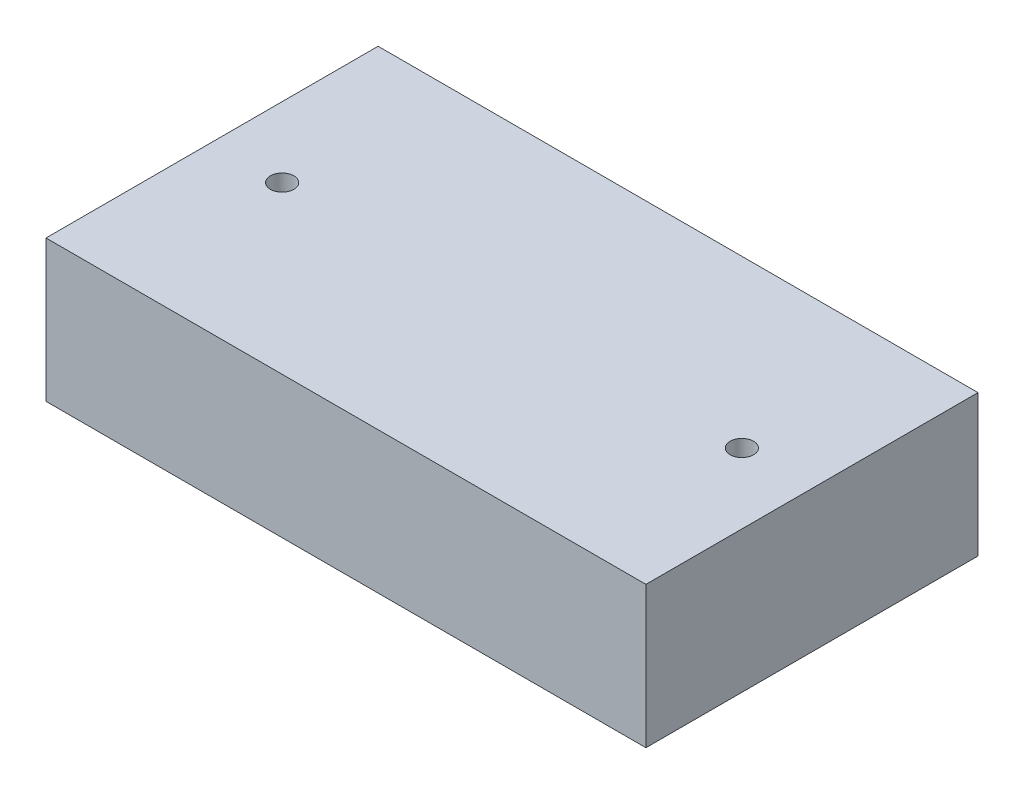
ISO-10303-21;
HEADER;
FILE_DESCRIPTION(('STEP AP214'),'2;1');
FILE_NAME('part.step','',(''),(''),'','','');
FILE_SCHEMA(('AUTOMOTIVE_DESIGN { 1 0 10303 214 1 1 1 1 }'));
ENDSEC;
DATA;
#1=APPLICATION_CONTEXT('core data for automotive mechanical design processes');
#2=APPLICATION_PROTOCOL_DEFINITION('international standard','automotive_design',2000,#1);
#3=PRODUCT_CONTEXT('',#1,'mechanical');
#4=PRODUCT('Part','Part','',(#3));
#5=PRODUCT_RELATED_PRODUCT_CATEGORY('part','',(#4));
#6=PRODUCT_DEFINITION_FORMATION('','',#4);
#7=PRODUCT_DEFINITION_CONTEXT('part definition',#1,'design');
#8=PRODUCT_DEFINITION('design','',#6,#7);
#9=PRODUCT_DEFINITION_SHAPE('','',#8);
#10=(LENGTH_UNIT() NAMED_UNIT(*) SI_UNIT(.MILLI.,.METRE.));
#11=(NAMED_UNIT(*) PLANE_ANGLE_UNIT() SI_UNIT($,.RADIAN.));
#12=(NAMED_UNIT(*) SI_UNIT($,.STERADIAN.) SOLID_ANGLE_UNIT());
#13=UNCERTAINTY_MEASURE_WITH_UNIT(LENGTH_MEASURE(1.E-05),#10,'distance_accuracy_value','');
#14=(GEOMETRIC_REPRESENTATION_CONTEXT(3) GLOBAL_UNCERTAINTY_ASSIGNED_CONTEXT((#13)) GLOBAL_UNIT_ASSIGNED_CONTEXT((#10,
#11,#12)) REPRESENTATION_CONTEXT('',''));
#15=CARTESIAN_POINT('',(0.,0.,0.));
#16=DIRECTION('',(0.,0.,1.));
#17=DIRECTION('',(1.,0.,0.));
#18=AXIS2_PLACEMENT_3D('',#15,#16,#17);
#19=CARTESIAN_POINT('',(38.3,18.07,21.2));
#20=DIRECTION('',(-1.,0.,0.));
#21=DIRECTION('',(0.,0.,1.));
#22=AXIS2_PLACEMENT_3D('',#19,#20,#21);
#23=PLANE('',#22);
#24=DIRECTION('',(0.,0.,-1.));
#25=VECTOR('',#24,1.);
#26=CARTESIAN_POINT('',(38.3,0.,21.2));
#27=LINE('',#26,#25);
#28=CARTESIAN_POINT('',(38.3,0.,21.2));
#29=VERTEX_POINT('',#28);
#30=CARTESIAN_POINT('',(38.3,0.,-21.2));
#31=VERTEX_POINT('',#30);
#32=EDGE_CURVE('E112',#29,#31,#27,.T.);
#33=ORIENTED_EDGE('',*,*,#32,.T.);
#34=DIRECTION('',(0.,-1.,0.));
#35=VECTOR('',#34,1.);
#36=CARTESIAN_POINT('',(38.3,18.07,-21.2));
#37=LINE('',#36,#35);
#38=CARTESIAN_POINT('',(38.3,18.07,-21.2));
#39=VERTEX_POINT('',#38);
#40=EDGE_CURVE('E11',#39,#31,#37,.T.);
#41=ORIENTED_EDGE('',*,*,#40,.F.);
#42=DIRECTION('',(0.,0.,-1.));
#43=VECTOR('',#42,1.);
#44=CARTESIAN_POINT('',(38.3,18.07,21.2));
#45=LINE('',#44,#43);
#46=CARTESIAN_POINT('',(38.3,18.07,21.2));
#47=VERTEX_POINT('',#46);
#48=EDGE_CURVE('E96',#47,#39,#45,.T.);
#49=ORIENTED_EDGE('',*,*,#48,.F.);
#50=DIRECTION('',(0.,-1.,0.));
#51=VECTOR('',#50,1.);
#52=CARTESIAN_POINT('',(38.3,18.07,21.2));
#53=LINE('',#52,#51);
#54=EDGE_CURVE('E108',#47,#29,#53,.T.);
#55=ORIENTED_EDGE('',*,*,#54,.T.);
#56=EDGE_LOOP('',(#33,#41,#49,#55));
#57=FACE_BOUND('',#56,.T.);
#58=ADVANCED_FACE('F44',(#57),#23,.F.);
#59=CARTESIAN_POINT('',(-38.3,18.07,-21.2));
#60=DIRECTION('',(0.,0.,1.));
#61=DIRECTION('',(1.,0.,0.));
#62=AXIS2_PLACEMENT_3D('',#59,#60,#61);
#63=PLANE('',#62);
#64=DIRECTION('',(-1.,0.,0.));
#65=VECTOR('',#64,1.);
#66=CARTESIAN_POINT('',(-38.3,0.,-21.2));
#67=LINE('',#66,#65);
#68=CARTESIAN_POINT('',(-38.3,0.,-21.2));
#69=VERTEX_POINT('',#68);
#70=EDGE_CURVE('E101',#31,#69,#67,.T.);
#71=ORIENTED_EDGE('',*,*,#70,.T.);
#72=DIRECTION('',(0.,-1.,0.));
#73=VECTOR('',#72,1.);
#74=CARTESIAN_POINT('',(-38.3,18.07,-21.2));
#75=LINE('',#74,#73);
#76=CARTESIAN_POINT('',(-38.3,18.07,-21.2));
#77=VERTEX_POINT('',#76);
#78=EDGE_CURVE('E53',#77,#69,#75,.T.);
#79=ORIENTED_EDGE('',*,*,#78,.F.);
#80=DIRECTION('',(-1.,0.,0.));
#81=VECTOR('',#80,1.);
#82=CARTESIAN_POINT('',(-38.3,18.07,-21.2));
#83=LINE('',#82,#81);
#84=EDGE_CURVE('E91',#39,#77,#83,.T.);
#85=ORIENTED_EDGE('',*,*,#84,.F.);
#86=ORIENTED_EDGE('',*,*,#40,.T.);
#87=EDGE_LOOP('',(#71,#79,#85,#86));
#88=FACE_BOUND('',#87,.T.);
#89=ADVANCED_FACE('F100',(#88),#63,.F.);
#90=CARTESIAN_POINT('',(-38.3,18.07,21.2));
#91=DIRECTION('',(1.,0.,0.));
#92=DIRECTION('',(0.,0.,-1.));
#93=AXIS2_PLACEMENT_3D('',#90,#91,#92);
#94=PLANE('',#93);
#95=DIRECTION('',(0.,0.,1.));
#96=VECTOR('',#95,1.);
#97=CARTESIAN_POINT('',(-38.3,0.,21.2));
#98=LINE('',#97,#96);
#99=CARTESIAN_POINT('',(-38.3,0.,21.2));
#100=VERTEX_POINT('',#99);
#101=EDGE_CURVE('E78',#69,#100,#98,.T.);
#102=ORIENTED_EDGE('',*,*,#101,.T.);
#103=DIRECTION('',(0.,-1.,0.));
#104=VECTOR('',#103,1.);
#105=CARTESIAN_POINT('',(-38.3,18.07,21.2));
#106=LINE('',#105,#104);
#107=CARTESIAN_POINT('',(-38.3,18.07,21.2));
#108=VERTEX_POINT('',#107);
#109=EDGE_CURVE('E103',#108,#100,#106,.T.);
#110=ORIENTED_EDGE('',*,*,#109,.F.);
#111=DIRECTION('',(0.,0.,1.));
#112=VECTOR('',#111,1.);
#113=CARTESIAN_POINT('',(-38.3,18.07,21.2));
#114=LINE('',#113,#112);
#115=EDGE_CURVE('E94',#77,#108,#114,.T.);
#116=ORIENTED_EDGE('',*,*,#115,.F.);
#117=ORIENTED_EDGE('',*,*,#78,.T.);
#118=EDGE_LOOP('',(#102,#110,#116,#117));
#119=FACE_BOUND('',#118,.T.);
#120=ADVANCED_FACE('F104',(#119),#94,.F.);
#121=CARTESIAN_POINT('',(-38.3,18.07,21.2));
#122=DIRECTION('',(0.,0.,-1.));
#123=DIRECTION('',(-1.,0.,0.));
#124=AXIS2_PLACEMENT_3D('',#121,#122,#123);
#125=PLANE('',#124);
#126=DIRECTION('',(1.,0.,0.));
#127=VECTOR('',#126,1.);
#128=CARTESIAN_POINT('',(-38.3,0.,21.2));
#129=LINE('',#128,#127);
#130=EDGE_CURVE('E84',#100,#29,#129,.T.);
#131=ORIENTED_EDGE('',*,*,#130,.T.);
#132=ORIENTED_EDGE('',*,*,#54,.F.);
#133=DIRECTION('',(1.,0.,0.));
#134=VECTOR('',#133,1.);
#135=CARTESIAN_POINT('',(-38.3,18.07,21.2));
#136=LINE('',#135,#134);
#137=EDGE_CURVE('E61',#108,#47,#136,.T.);
#138=ORIENTED_EDGE('',*,*,#137,.F.);
#139=ORIENTED_EDGE('',*,*,#109,.T.);
#140=EDGE_LOOP('',(#131,#132,#138,#139));
#141=FACE_BOUND('',#140,.T.);
#142=ADVANCED_FACE('F126',(#141),#125,.F.);
#143=CARTESIAN_POINT('',(0.,18.07,0.));
#144=DIRECTION('',(0.,-1.,0.));
#145=DIRECTION('',(0.,0.,-1.));
#146=AXIS2_PLACEMENT_3D('',#143,#144,#145);
#147=PLANE('',#146);
#148=CARTESIAN_POINT('',(29.35,18.07,0.));
#149=DIRECTION('',(0.,1.,0.));
#150=DIRECTION('',(0.,0.,1.));
#151=AXIS2_PLACEMENT_3D('',#148,#149,#150);
#152=CIRCLE('',#151,1.5);
#153=CARTESIAN_POINT('',(29.35,18.07,1.5));
#154=VERTEX_POINT('',#153);
#155=EDGE_CURVE('E142',#154,#154,#152,.T.);
#156=ORIENTED_EDGE('',*,*,#155,.F.);
#157=EDGE_LOOP('',(#156));
#158=FACE_BOUND('',#157,.T.);
#159=CARTESIAN_POINT('',(-29.35,18.07,0.));
#160=DIRECTION('',(0.,1.,0.));
#161=DIRECTION('',(0.,0.,-1.));
#162=AXIS2_PLACEMENT_3D('',#159,#160,#161);
#163=CIRCLE('',#162,1.5);
#164=CARTESIAN_POINT('',(-29.35,18.07,-1.5));
#165=VERTEX_POINT('',#164);
#166=EDGE_CURVE('E137',#165,#165,#163,.T.);
#167=ORIENTED_EDGE('',*,*,#166,.F.);
#168=EDGE_LOOP('',(#167));
#169=FACE_BOUND('',#168,.T.);
#170=ORIENTED_EDGE('',*,*,#48,.T.);
#171=ORIENTED_EDGE('',*,*,#84,.T.);
#172=ORIENTED_EDGE('',*,*,#115,.T.);
#173=ORIENTED_EDGE('',*,*,#137,.T.);
#174=EDGE_LOOP('',(#170,#171,#172,#173));
#175=FACE_BOUND('',#174,.T.);
#176=ADVANCED_FACE('F92',(#158,#169,#175),#147,.F.);
#177=CARTESIAN_POINT('',(0.,0.,0.));
#178=DIRECTION('',(0.,-1.,0.));
#179=DIRECTION('',(0.,0.,-1.));
#180=AXIS2_PLACEMENT_3D('',#177,#178,#179);
#181=PLANE('',#180);
#182=CARTESIAN_POINT('',(20.,0.,0.));
#183=DIRECTION('',(0.,-1.,0.));
#184=DIRECTION('',(0.,0.,-1.));
#185=AXIS2_PLACEMENT_3D('',#182,#183,#184);
#186=CIRCLE('',#185,1.5);
#187=CARTESIAN_POINT('',(20.,0.,-1.5));
#188=VERTEX_POINT('',#187);
#189=EDGE_CURVE('E157',#188,#188,#186,.T.);
#190=ORIENTED_EDGE('',*,*,#189,.F.);
#191=EDGE_LOOP('',(#190));
#192=FACE_BOUND('',#191,.T.);
#193=CARTESIAN_POINT('',(-20.,0.,0.));
#194=DIRECTION('',(0.,-1.,0.));
#195=DIRECTION('',(0.,0.,1.));
#196=AXIS2_PLACEMENT_3D('',#193,#194,#195);
#197=CIRCLE('',#196,1.5);
#198=CARTESIAN_POINT('',(-20.,0.,1.5));
#199=VERTEX_POINT('',#198);
#200=EDGE_CURVE('E153',#199,#199,#197,.T.);
#201=ORIENTED_EDGE('',*,*,#200,.F.);
#202=EDGE_LOOP('',(#201));
#203=FACE_BOUND('',#202,.T.);
#204=ORIENTED_EDGE('',*,*,#32,.F.);
#205=ORIENTED_EDGE('',*,*,#130,.F.);
#206=ORIENTED_EDGE('',*,*,#101,.F.);
#207=ORIENTED_EDGE('',*,*,#70,.F.);
#208=EDGE_LOOP('',(#204,#205,#206,#207));
#209=FACE_BOUND('',#208,.T.);
#210=ADVANCED_FACE('F129',(#192,#203,#209),#181,.T.);
#211=CARTESIAN_POINT('',(-29.35,8.07,0.));
#212=DIRECTION('',(0.,1.,0.));
#213=DIRECTION('',(0.,0.,1.));
#214=AXIS2_PLACEMENT_3D('',#211,#212,#213);
#215=CYLINDRICAL_SURFACE('',#214,1.5);
#216=CARTESIAN_POINT('',(-29.35,8.07,0.));
#217=DIRECTION('',(0.,1.,0.));
#218=DIRECTION('',(0.,0.,-1.));
#219=AXIS2_PLACEMENT_3D('',#216,#217,#218);
#220=CIRCLE('',#219,1.5);
#221=CARTESIAN_POINT('',(-29.35,8.07,-1.5));
#222=VERTEX_POINT('',#221);
#223=EDGE_CURVE('E133',#222,#222,#220,.T.);
#224=ORIENTED_EDGE('',*,*,#223,.F.);
#225=EDGE_LOOP('',(#224));
#226=FACE_BOUND('',#225,.T.);
#227=ORIENTED_EDGE('',*,*,#166,.T.);
#228=EDGE_LOOP('',(#227));
#229=FACE_BOUND('',#228,.T.);
#230=ADVANCED_FACE('F176',(#226,#229),#215,.F.);
#231=CARTESIAN_POINT('',(-29.35,8.07,0.));
#232=DIRECTION('',(0.,-1.,0.));
#233=DIRECTION('',(0.,0.,-1.));
#234=AXIS2_PLACEMENT_3D('',#231,#232,#233);
#235=PLANE('',#234);
#236=ORIENTED_EDGE('',*,*,#223,.T.);
#237=EDGE_LOOP('',(#236));
#238=FACE_BOUND('',#237,.T.);
#239=ADVANCED_FACE('F209',(#238),#235,.F.);
#240=CARTESIAN_POINT('',(29.35,8.07,0.));
#241=DIRECTION('',(0.,1.,0.));
#242=DIRECTION('',(0.,0.,1.));
#243=AXIS2_PLACEMENT_3D('',#240,#241,#242);
#244=CYLINDRICAL_SURFACE('',#243,1.5);
#245=CARTESIAN_POINT('',(29.35,8.07,0.));
#246=DIRECTION('',(0.,1.,0.));
#247=DIRECTION('',(0.,0.,1.));
#248=AXIS2_PLACEMENT_3D('',#245,#246,#247);
#249=CIRCLE('',#248,1.5);
#250=CARTESIAN_POINT('',(29.35,8.07,1.5));
#251=VERTEX_POINT('',#250);
#252=EDGE_CURVE('E116',#251,#251,#249,.T.);
#253=ORIENTED_EDGE('',*,*,#252,.F.);
#254=EDGE_LOOP('',(#253));
#255=FACE_BOUND('',#254,.T.);
#256=ORIENTED_EDGE('',*,*,#155,.T.);
#257=EDGE_LOOP('',(#256));
#258=FACE_BOUND('',#257,.T.);
#259=ADVANCED_FACE('F191',(#255,#258),#244,.F.);
#260=CARTESIAN_POINT('',(29.35,8.07,0.));
#261=DIRECTION('',(0.,1.,0.));
#262=DIRECTION('',(0.,0.,1.));
#263=AXIS2_PLACEMENT_3D('',#260,#261,#262);
#264=PLANE('',#263);
#265=ORIENTED_EDGE('',*,*,#252,.T.);
#266=EDGE_LOOP('',(#265));
#267=FACE_BOUND('',#266,.T.);
#268=ADVANCED_FACE('F182',(#267),#264,.T.);
#269=CARTESIAN_POINT('',(-20.,10.,0.));
#270=DIRECTION('',(0.,-1.,0.));
#271=DIRECTION('',(0.,0.,-1.));
#272=AXIS2_PLACEMENT_3D('',#269,#270,#271);
#273=CYLINDRICAL_SURFACE('',#272,1.5);
#274=CARTESIAN_POINT('',(-20.,10.,0.));
#275=DIRECTION('',(0.,-1.,0.));
#276=DIRECTION('',(0.,0.,1.));
#277=AXIS2_PLACEMENT_3D('',#274,#275,#276);
#278=CIRCLE('',#277,1.5);
#279=CARTESIAN_POINT('',(-20.,10.,1.5));
#280=VERTEX_POINT('',#279);
#281=EDGE_CURVE('E149',#280,#280,#278,.T.);
#282=ORIENTED_EDGE('',*,*,#281,.F.);
#283=EDGE_LOOP('',(#282));
#284=FACE_BOUND('',#283,.T.);
#285=ORIENTED_EDGE('',*,*,#200,.T.);
#286=EDGE_LOOP('',(#285));
#287=FACE_BOUND('',#286,.T.);
#288=ADVANCED_FACE('F180',(#284,#287),#273,.F.);
#289=CARTESIAN_POINT('',(-20.,10.,0.));
#290=DIRECTION('',(0.,1.,0.));
#291=DIRECTION('',(0.,0.,1.));
#292=AXIS2_PLACEMENT_3D('',#289,#290,#291);
#293=PLANE('',#292);
#294=ORIENTED_EDGE('',*,*,#281,.T.);
#295=EDGE_LOOP('',(#294));
#296=FACE_BOUND('',#295,.T.);
#297=ADVANCED_FACE('F170',(#296),#293,.F.);
#298=CARTESIAN_POINT('',(20.,10.,0.));
#299=DIRECTION('',(0.,-1.,0.));
#300=DIRECTION('',(0.,0.,-1.));
#301=AXIS2_PLACEMENT_3D('',#298,#299,#300);
#302=CYLINDRICAL_SURFACE('',#301,1.5);
#303=CARTESIAN_POINT('',(20.,10.,0.));
#304=DIRECTION('',(0.,-1.,0.));
#305=DIRECTION('',(0.,0.,-1.));
#306=AXIS2_PLACEMENT_3D('',#303,#304,#305);
#307=CIRCLE('',#306,1.5);
#308=CARTESIAN_POINT('',(20.,10.,-1.5));
#309=VERTEX_POINT('',#308);
#310=EDGE_CURVE('E138',#309,#309,#307,.T.);
#311=ORIENTED_EDGE('',*,*,#310,.F.);
#312=EDGE_LOOP('',(#311));
#313=FACE_BOUND('',#312,.T.);
#314=ORIENTED_EDGE('',*,*,#189,.T.);
#315=EDGE_LOOP('',(#314));
#316=FACE_BOUND('',#315,.T.);
#317=ADVANCED_FACE('F167',(#313,#316),#302,.F.);
#318=CARTESIAN_POINT('',(20.,10.,0.));
#319=DIRECTION('',(0.,-1.,0.));
#320=DIRECTION('',(0.,0.,-1.));
#321=AXIS2_PLACEMENT_3D('',#318,#319,#320);
#322=PLANE('',#321);
#323=ORIENTED_EDGE('',*,*,#310,.T.);
#324=EDGE_LOOP('',(#323));
#325=FACE_BOUND('',#324,.T.);
#326=ADVANCED_FACE('F165',(#325),#322,.T.);
#327=CLOSED_SHELL('',(#58,#89,#120,#142,#176,#210,#230,#239,#259,#268,#288,#297,#317,#326));
#328=MANIFOLD_SOLID_BREP('B2',#327);
#329=ADVANCED_BREP_SHAPE_REPRESENTATION('',(#18,#328),#14);
#330=SHAPE_DEFINITION_REPRESENTATION(#9,#329);
ENDSEC;
END-ISO-10303-21;
